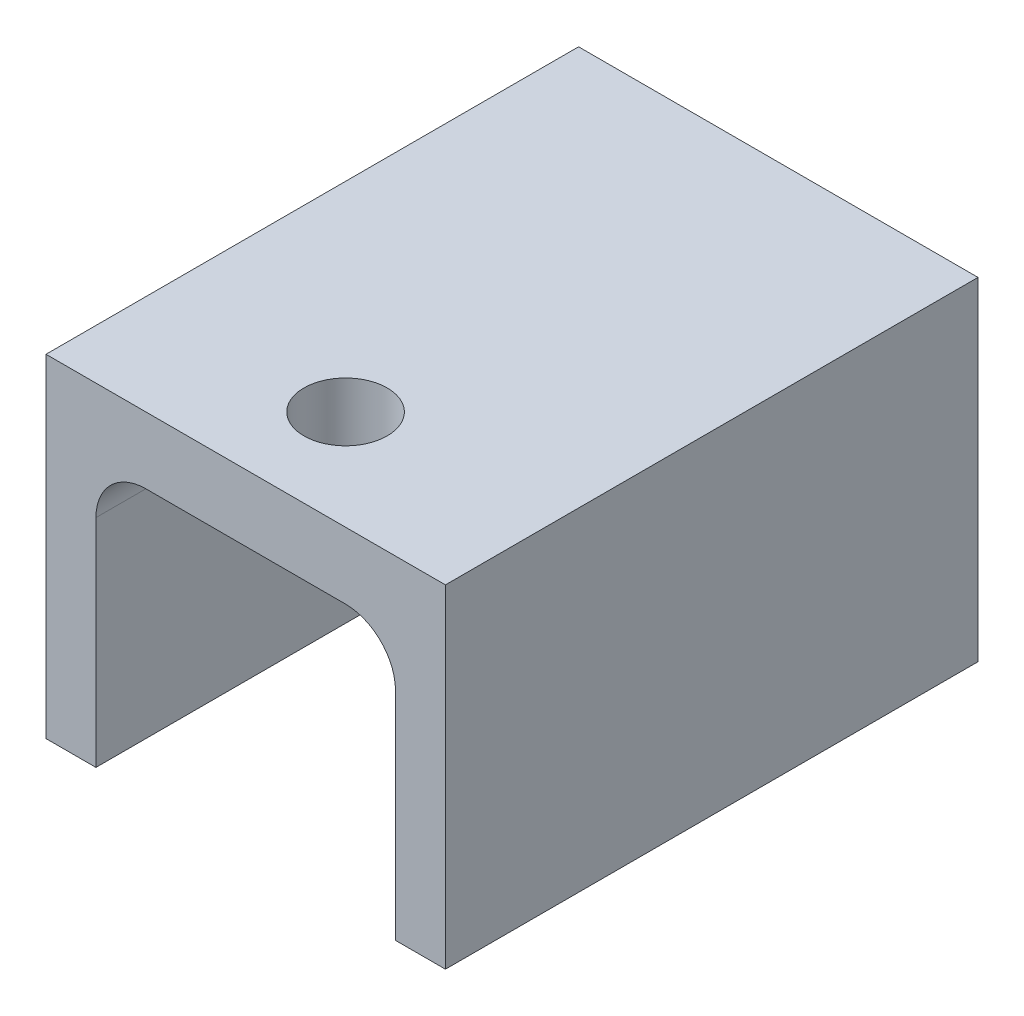
ISO-10303-21;
HEADER;
FILE_DESCRIPTION(('STEP AP214'),'2;1');
FILE_NAME('part.step','',(''),(''),'','','');
FILE_SCHEMA(('AUTOMOTIVE_DESIGN { 1 0 10303 214 1 1 1 1 }'));
ENDSEC;
DATA;
#1=APPLICATION_CONTEXT('core data for automotive mechanical design processes');
#2=APPLICATION_PROTOCOL_DEFINITION('international standard','automotive_design',2000,#1);
#3=PRODUCT_CONTEXT('',#1,'mechanical');
#4=PRODUCT('Part','Part','',(#3));
#5=PRODUCT_RELATED_PRODUCT_CATEGORY('part','',(#4));
#6=PRODUCT_DEFINITION_FORMATION('','',#4);
#7=PRODUCT_DEFINITION_CONTEXT('part definition',#1,'design');
#8=PRODUCT_DEFINITION('design','',#6,#7);
#9=PRODUCT_DEFINITION_SHAPE('','',#8);
#10=(LENGTH_UNIT() NAMED_UNIT(*) SI_UNIT(.MILLI.,.METRE.));
#11=(NAMED_UNIT(*) PLANE_ANGLE_UNIT() SI_UNIT($,.RADIAN.));
#12=(NAMED_UNIT(*) SI_UNIT($,.STERADIAN.) SOLID_ANGLE_UNIT());
#13=UNCERTAINTY_MEASURE_WITH_UNIT(LENGTH_MEASURE(1.E-05),#10,'distance_accuracy_value','');
#14=(GEOMETRIC_REPRESENTATION_CONTEXT(3) GLOBAL_UNCERTAINTY_ASSIGNED_CONTEXT((#13)) GLOBAL_UNIT_ASSIGNED_CONTEXT((#10,
#11,#12)) REPRESENTATION_CONTEXT('',''));
#15=CARTESIAN_POINT('',(0.,0.,0.));
#16=DIRECTION('',(0.,0.,1.));
#17=DIRECTION('',(1.,0.,0.));
#18=AXIS2_PLACEMENT_3D('',#15,#16,#17);
#19=CARTESIAN_POINT('',(-9.,10.,4.));
#20=DIRECTION('',(0.,-1.,0.));
#21=DIRECTION('',(0.,0.,-1.));
#22=AXIS2_PLACEMENT_3D('',#19,#20,#21);
#23=PLANE('',#22);
#24=CARTESIAN_POINT('',(0.,10.,26.));
#25=DIRECTION('',(0.,-1.,0.));
#26=DIRECTION('',(0.,0.,-1.));
#27=AXIS2_PLACEMENT_3D('',#24,#25,#26);
#28=CIRCLE('',#27,2.5);
#29=CARTESIAN_POINT('',(0.,10.,23.5));
#30=VERTEX_POINT('',#29);
#31=EDGE_CURVE('E178',#30,#30,#28,.T.);
#32=ORIENTED_EDGE('',*,*,#31,.T.);
#33=EDGE_LOOP('',(#32));
#34=FACE_BOUND('',#33,.T.);
#35=DIRECTION('',(-1.,0.,0.));
#36=VECTOR('',#35,1.);
#37=CARTESIAN_POINT('',(-9.,10.,0.));
#38=LINE('',#37,#36);
#39=CARTESIAN_POINT('',(12.,10.,0.));
#40=VERTEX_POINT('',#39);
#41=CARTESIAN_POINT('',(-12.,10.,0.));
#42=VERTEX_POINT('',#41);
#43=EDGE_CURVE('E190',#40,#42,#38,.T.);
#44=ORIENTED_EDGE('',*,*,#43,.T.);
#45=DIRECTION('',(0.,0.,-1.));
#46=VECTOR('',#45,1.);
#47=CARTESIAN_POINT('',(-12.,10.,0.));
#48=LINE('',#47,#46);
#49=CARTESIAN_POINT('',(-12.,10.,32.));
#50=VERTEX_POINT('',#49);
#51=EDGE_CURVE('E150',#50,#42,#48,.T.);
#52=ORIENTED_EDGE('',*,*,#51,.F.);
#53=DIRECTION('',(-1.,0.,0.));
#54=VECTOR('',#53,1.);
#55=CARTESIAN_POINT('',(-9.,10.,32.));
#56=LINE('',#55,#54);
#57=CARTESIAN_POINT('',(12.,10.,32.));
#58=VERTEX_POINT('',#57);
#59=EDGE_CURVE('E188',#58,#50,#56,.T.);
#60=ORIENTED_EDGE('',*,*,#59,.F.);
#61=DIRECTION('',(0.,0.,1.));
#62=VECTOR('',#61,1.);
#63=CARTESIAN_POINT('',(12.,10.,32.));
#64=LINE('',#63,#62);
#65=EDGE_CURVE('E162',#40,#58,#64,.T.);
#66=ORIENTED_EDGE('',*,*,#65,.F.);
#67=EDGE_LOOP('',(#44,#52,#60,#66));
#68=FACE_BOUND('',#67,.T.);
#69=ADVANCED_FACE('F36',(#34,#68),#23,.F.);
#70=CARTESIAN_POINT('',(-9.,-10.,4.));
#71=DIRECTION('',(0.,1.,0.));
#72=DIRECTION('',(0.,0.,1.));
#73=AXIS2_PLACEMENT_3D('',#70,#71,#72);
#74=PLANE('',#73);
#75=DIRECTION('',(1.,0.,0.));
#76=VECTOR('',#75,1.);
#77=CARTESIAN_POINT('',(-9.,-10.,0.));
#78=LINE('',#77,#76);
#79=CARTESIAN_POINT('',(-12.,-10.,0.));
#80=VERTEX_POINT('',#79);
#81=CARTESIAN_POINT('',(12.,-10.,0.));
#82=VERTEX_POINT('',#81);
#83=EDGE_CURVE('E195',#80,#82,#78,.T.);
#84=ORIENTED_EDGE('',*,*,#83,.T.);
#85=DIRECTION('',(0.,0.,-1.));
#86=VECTOR('',#85,1.);
#87=CARTESIAN_POINT('',(12.,-10.,0.));
#88=LINE('',#87,#86);
#89=CARTESIAN_POINT('',(12.,-10.,32.));
#90=VERTEX_POINT('',#89);
#91=EDGE_CURVE('E129',#90,#82,#88,.T.);
#92=ORIENTED_EDGE('',*,*,#91,.F.);
#93=DIRECTION('',(1.,0.,0.));
#94=VECTOR('',#93,1.);
#95=CARTESIAN_POINT('',(9.,-10.,32.));
#96=LINE('',#95,#94);
#97=CARTESIAN_POINT('',(9.,-10.,32.));
#98=VERTEX_POINT('',#97);
#99=EDGE_CURVE('E116',#98,#90,#96,.T.);
#100=ORIENTED_EDGE('',*,*,#99,.F.);
#101=DIRECTION('',(0.,0.,-1.));
#102=VECTOR('',#101,1.);
#103=CARTESIAN_POINT('',(9.,-10.,4.));
#104=LINE('',#103,#102);
#105=CARTESIAN_POINT('',(9.,-10.,4.));
#106=VERTEX_POINT('',#105);
#107=EDGE_CURVE('E121',#98,#106,#104,.T.);
#108=ORIENTED_EDGE('',*,*,#107,.T.);
#109=DIRECTION('',(1.,0.,0.));
#110=VECTOR('',#109,1.);
#111=CARTESIAN_POINT('',(-9.,-10.,4.));
#112=LINE('',#111,#110);
#113=CARTESIAN_POINT('',(-9.,-10.,4.));
#114=VERTEX_POINT('',#113);
#115=EDGE_CURVE('E197',#114,#106,#112,.T.);
#116=ORIENTED_EDGE('',*,*,#115,.F.);
#117=DIRECTION('',(0.,0.,1.));
#118=VECTOR('',#117,1.);
#119=CARTESIAN_POINT('',(-9.,-10.,4.));
#120=LINE('',#119,#118);
#121=CARTESIAN_POINT('',(-9.,-10.,32.));
#122=VERTEX_POINT('',#121);
#123=EDGE_CURVE('E139',#114,#122,#120,.T.);
#124=ORIENTED_EDGE('',*,*,#123,.T.);
#125=DIRECTION('',(-1.,0.,0.));
#126=VECTOR('',#125,1.);
#127=CARTESIAN_POINT('',(-9.,-10.,32.));
#128=LINE('',#127,#126);
#129=CARTESIAN_POINT('',(-12.,-10.,32.));
#130=VERTEX_POINT('',#129);
#131=EDGE_CURVE('E142',#122,#130,#128,.T.);
#132=ORIENTED_EDGE('',*,*,#131,.T.);
#133=DIRECTION('',(0.,0.,1.));
#134=VECTOR('',#133,1.);
#135=CARTESIAN_POINT('',(-12.,-10.,4.));
#136=LINE('',#135,#134);
#137=EDGE_CURVE('E145',#80,#130,#136,.T.);
#138=ORIENTED_EDGE('',*,*,#137,.F.);
#139=EDGE_LOOP('',(#84,#92,#100,#108,#116,#124,#132,#138));
#140=FACE_BOUND('',#139,.T.);
#141=ADVANCED_FACE('F126',(#140),#74,.F.);
#142=CARTESIAN_POINT('',(0.,0.,4.));
#143=DIRECTION('',(0.,0.,1.));
#144=DIRECTION('',(1.,0.,0.));
#145=AXIS2_PLACEMENT_3D('',#142,#143,#144);
#146=PLANE('',#145);
#147=CARTESIAN_POINT('',(-6.,-6.75,4.));
#148=DIRECTION('',(0.,0.,1.));
#149=DIRECTION('',(1.,0.,0.));
#150=AXIS2_PLACEMENT_3D('',#147,#148,#149);
#151=CIRCLE('',#150,1.5);
#152=CARTESIAN_POINT('',(-4.5,-6.75,4.));
#153=VERTEX_POINT('',#152);
#154=EDGE_CURVE('E169',#153,#153,#151,.T.);
#155=ORIENTED_EDGE('',*,*,#154,.F.);
#156=EDGE_LOOP('',(#155));
#157=FACE_BOUND('',#156,.T.);
#158=CARTESIAN_POINT('',(6.,-0.25,4.));
#159=DIRECTION('',(0.,0.,1.));
#160=DIRECTION('',(1.,0.,0.));
#161=AXIS2_PLACEMENT_3D('',#158,#159,#160);
#162=CIRCLE('',#161,1.5);
#163=CARTESIAN_POINT('',(7.5,-0.25,4.));
#164=VERTEX_POINT('',#163);
#165=EDGE_CURVE('E168',#164,#164,#162,.T.);
#166=ORIENTED_EDGE('',*,*,#165,.F.);
#167=EDGE_LOOP('',(#166));
#168=FACE_BOUND('',#167,.T.);
#169=CARTESIAN_POINT('',(6.,-6.75,4.));
#170=DIRECTION('',(0.,0.,1.));
#171=DIRECTION('',(1.,0.,0.));
#172=AXIS2_PLACEMENT_3D('',#169,#170,#171);
#173=CIRCLE('',#172,1.5);
#174=CARTESIAN_POINT('',(7.5,-6.75,4.));
#175=VERTEX_POINT('',#174);
#176=EDGE_CURVE('E165',#175,#175,#173,.T.);
#177=ORIENTED_EDGE('',*,*,#176,.F.);
#178=EDGE_LOOP('',(#177));
#179=FACE_BOUND('',#178,.T.);
#180=CARTESIAN_POINT('',(-6.,-0.25,4.));
#181=DIRECTION('',(0.,0.,1.));
#182=DIRECTION('',(1.,0.,0.));
#183=AXIS2_PLACEMENT_3D('',#180,#181,#182);
#184=CIRCLE('',#183,1.5);
#185=CARTESIAN_POINT('',(-4.5,-0.25,4.));
#186=VERTEX_POINT('',#185);
#187=EDGE_CURVE('E172',#186,#186,#184,.T.);
#188=ORIENTED_EDGE('',*,*,#187,.F.);
#189=EDGE_LOOP('',(#188));
#190=FACE_BOUND('',#189,.T.);
#191=DIRECTION('',(1.,0.,0.));
#192=VECTOR('',#191,1.);
#193=CARTESIAN_POINT('',(-9.,6.,4.));
#194=LINE('',#193,#192);
#195=CARTESIAN_POINT('',(-6.,6.,4.));
#196=VERTEX_POINT('',#195);
#197=CARTESIAN_POINT('',(6.,6.,4.));
#198=VERTEX_POINT('',#197);
#199=EDGE_CURVE('E181',#196,#198,#194,.T.);
#200=ORIENTED_EDGE('',*,*,#199,.F.);
#201=CARTESIAN_POINT('',(-6.,3.,4.));
#202=DIRECTION('',(0.,0.,1.));
#203=DIRECTION('',(1.,0.,0.));
#204=AXIS2_PLACEMENT_3D('',#201,#202,#203);
#205=CIRCLE('',#204,3.);
#206=CARTESIAN_POINT('',(-9.,3.,4.));
#207=VERTEX_POINT('',#206);
#208=EDGE_CURVE('E218',#196,#207,#205,.T.);
#209=ORIENTED_EDGE('',*,*,#208,.T.);
#210=DIRECTION('',(0.,-1.,0.));
#211=VECTOR('',#210,1.);
#212=CARTESIAN_POINT('',(-9.,10.,4.));
#213=LINE('',#212,#211);
#214=EDGE_CURVE('E194',#207,#114,#213,.T.);
#215=ORIENTED_EDGE('',*,*,#214,.T.);
#216=ORIENTED_EDGE('',*,*,#115,.T.);
#217=DIRECTION('',(0.,1.,0.));
#218=VECTOR('',#217,1.);
#219=CARTESIAN_POINT('',(9.,10.,4.));
#220=LINE('',#219,#218);
#221=CARTESIAN_POINT('',(9.,3.,4.));
#222=VERTEX_POINT('',#221);
#223=EDGE_CURVE('E135',#106,#222,#220,.T.);
#224=ORIENTED_EDGE('',*,*,#223,.T.);
#225=CARTESIAN_POINT('',(6.,3.,4.));
#226=DIRECTION('',(0.,0.,1.));
#227=DIRECTION('',(1.,0.,0.));
#228=AXIS2_PLACEMENT_3D('',#225,#226,#227);
#229=CIRCLE('',#228,3.);
#230=EDGE_CURVE('E216',#222,#198,#229,.T.);
#231=ORIENTED_EDGE('',*,*,#230,.T.);
#232=EDGE_LOOP('',(#200,#209,#215,#216,#224,#231));
#233=FACE_BOUND('',#232,.T.);
#234=ADVANCED_FACE('F232',(#157,#168,#179,#190,#233),#146,.T.);
#235=CARTESIAN_POINT('',(0.,0.,0.));
#236=DIRECTION('',(0.,0.,1.));
#237=DIRECTION('',(1.,0.,0.));
#238=AXIS2_PLACEMENT_3D('',#235,#236,#237);
#239=PLANE('',#238);
#240=CARTESIAN_POINT('',(-6.,-6.75,0.));
#241=DIRECTION('',(0.,0.,1.));
#242=DIRECTION('',(1.,0.,0.));
#243=AXIS2_PLACEMENT_3D('',#240,#241,#242);
#244=CIRCLE('',#243,1.5);
#245=CARTESIAN_POINT('',(-4.5,-6.75,0.));
#246=VERTEX_POINT('',#245);
#247=EDGE_CURVE('E185',#246,#246,#244,.T.);
#248=ORIENTED_EDGE('',*,*,#247,.T.);
#249=EDGE_LOOP('',(#248));
#250=FACE_BOUND('',#249,.T.);
#251=CARTESIAN_POINT('',(6.,-0.25,0.));
#252=DIRECTION('',(0.,0.,1.));
#253=DIRECTION('',(1.,0.,0.));
#254=AXIS2_PLACEMENT_3D('',#251,#252,#253);
#255=CIRCLE('',#254,1.5);
#256=CARTESIAN_POINT('',(7.5,-0.25,0.));
#257=VERTEX_POINT('',#256);
#258=EDGE_CURVE('E207',#257,#257,#255,.T.);
#259=ORIENTED_EDGE('',*,*,#258,.T.);
#260=EDGE_LOOP('',(#259));
#261=FACE_BOUND('',#260,.T.);
#262=CARTESIAN_POINT('',(6.,-6.75,0.));
#263=DIRECTION('',(0.,0.,1.));
#264=DIRECTION('',(1.,0.,0.));
#265=AXIS2_PLACEMENT_3D('',#262,#263,#264);
#266=CIRCLE('',#265,1.5);
#267=CARTESIAN_POINT('',(7.5,-6.75,0.));
#268=VERTEX_POINT('',#267);
#269=EDGE_CURVE('E204',#268,#268,#266,.T.);
#270=ORIENTED_EDGE('',*,*,#269,.T.);
#271=EDGE_LOOP('',(#270));
#272=FACE_BOUND('',#271,.T.);
#273=CARTESIAN_POINT('',(-6.,-0.25,0.));
#274=DIRECTION('',(0.,0.,1.));
#275=DIRECTION('',(1.,0.,0.));
#276=AXIS2_PLACEMENT_3D('',#273,#274,#275);
#277=CIRCLE('',#276,1.5);
#278=CARTESIAN_POINT('',(-4.5,-0.25,0.));
#279=VERTEX_POINT('',#278);
#280=EDGE_CURVE('E177',#279,#279,#277,.T.);
#281=ORIENTED_EDGE('',*,*,#280,.T.);
#282=EDGE_LOOP('',(#281));
#283=FACE_BOUND('',#282,.T.);
#284=ORIENTED_EDGE('',*,*,#43,.F.);
#285=DIRECTION('',(0.,1.,0.));
#286=VECTOR('',#285,1.);
#287=CARTESIAN_POINT('',(12.,10.,0.));
#288=LINE('',#287,#286);
#289=EDGE_CURVE('E159',#82,#40,#288,.T.);
#290=ORIENTED_EDGE('',*,*,#289,.F.);
#291=ORIENTED_EDGE('',*,*,#83,.F.);
#292=DIRECTION('',(0.,-1.,0.));
#293=VECTOR('',#292,1.);
#294=CARTESIAN_POINT('',(-12.,-10.,0.));
#295=LINE('',#294,#293);
#296=EDGE_CURVE('E153',#42,#80,#295,.T.);
#297=ORIENTED_EDGE('',*,*,#296,.F.);
#298=EDGE_LOOP('',(#284,#290,#291,#297));
#299=FACE_BOUND('',#298,.T.);
#300=ADVANCED_FACE('F250',(#250,#261,#272,#283,#299),#239,.F.);
#301=CARTESIAN_POINT('',(-9.,6.,32.));
#302=DIRECTION('',(0.,1.,0.));
#303=DIRECTION('',(0.,0.,1.));
#304=AXIS2_PLACEMENT_3D('',#301,#302,#303);
#305=PLANE('',#304);
#306=CARTESIAN_POINT('',(0.,6.,26.));
#307=DIRECTION('',(0.,-1.,0.));
#308=DIRECTION('',(0.,0.,-1.));
#309=AXIS2_PLACEMENT_3D('',#306,#307,#308);
#310=CIRCLE('',#309,2.5);
#311=CARTESIAN_POINT('',(0.,6.,23.5));
#312=VERTEX_POINT('',#311);
#313=EDGE_CURVE('E182',#312,#312,#310,.T.);
#314=ORIENTED_EDGE('',*,*,#313,.F.);
#315=EDGE_LOOP('',(#314));
#316=FACE_BOUND('',#315,.T.);
#317=DIRECTION('',(1.,0.,0.));
#318=VECTOR('',#317,1.);
#319=CARTESIAN_POINT('',(-9.,6.,32.));
#320=LINE('',#319,#318);
#321=CARTESIAN_POINT('',(-6.,6.,32.));
#322=VERTEX_POINT('',#321);
#323=CARTESIAN_POINT('',(6.,6.,32.));
#324=VERTEX_POINT('',#323);
#325=EDGE_CURVE('E186',#322,#324,#320,.T.);
#326=ORIENTED_EDGE('',*,*,#325,.F.);
#327=DIRECTION('',(0.,0.,-1.));
#328=VECTOR('',#327,1.);
#329=CARTESIAN_POINT('',(-6.,6.,32.));
#330=LINE('',#329,#328);
#331=EDGE_CURVE('E213',#322,#196,#330,.T.);
#332=ORIENTED_EDGE('',*,*,#331,.T.);
#333=ORIENTED_EDGE('',*,*,#199,.T.);
#334=DIRECTION('',(0.,0.,-1.));
#335=VECTOR('',#334,1.);
#336=CARTESIAN_POINT('',(6.,6.,32.));
#337=LINE('',#336,#335);
#338=EDGE_CURVE('E199',#198,#324,#337,.F.);
#339=ORIENTED_EDGE('',*,*,#338,.T.);
#340=EDGE_LOOP('',(#326,#332,#333,#339));
#341=FACE_BOUND('',#340,.T.);
#342=ADVANCED_FACE('F227',(#316,#341),#305,.F.);
#343=CARTESIAN_POINT('',(0.,0.,32.));
#344=DIRECTION('',(0.,0.,1.));
#345=DIRECTION('',(1.,0.,0.));
#346=AXIS2_PLACEMENT_3D('',#343,#344,#345);
#347=PLANE('',#346);
#348=ORIENTED_EDGE('',*,*,#59,.T.);
#349=DIRECTION('',(0.,1.,0.));
#350=VECTOR('',#349,1.);
#351=CARTESIAN_POINT('',(-12.,10.,32.));
#352=LINE('',#351,#350);
#353=EDGE_CURVE('E147',#130,#50,#352,.T.);
#354=ORIENTED_EDGE('',*,*,#353,.F.);
#355=ORIENTED_EDGE('',*,*,#131,.F.);
#356=DIRECTION('',(0.,1.,0.));
#357=VECTOR('',#356,1.);
#358=CARTESIAN_POINT('',(-9.,-10.,32.));
#359=LINE('',#358,#357);
#360=CARTESIAN_POINT('',(-9.,3.,32.));
#361=VERTEX_POINT('',#360);
#362=EDGE_CURVE('E130',#122,#361,#359,.T.);
#363=ORIENTED_EDGE('',*,*,#362,.T.);
#364=CARTESIAN_POINT('',(-6.,3.,32.));
#365=DIRECTION('',(0.,0.,1.));
#366=DIRECTION('',(1.,0.,0.));
#367=AXIS2_PLACEMENT_3D('',#364,#365,#366);
#368=CIRCLE('',#367,3.);
#369=EDGE_CURVE('E44',#361,#322,#368,.F.);
#370=ORIENTED_EDGE('',*,*,#369,.T.);
#371=ORIENTED_EDGE('',*,*,#325,.T.);
#372=CARTESIAN_POINT('',(6.,3.,32.));
#373=DIRECTION('',(0.,0.,1.));
#374=DIRECTION('',(1.,0.,0.));
#375=AXIS2_PLACEMENT_3D('',#372,#373,#374);
#376=CIRCLE('',#375,3.);
#377=CARTESIAN_POINT('',(9.,3.,32.));
#378=VERTEX_POINT('',#377);
#379=EDGE_CURVE('E11',#324,#378,#376,.F.);
#380=ORIENTED_EDGE('',*,*,#379,.T.);
#381=DIRECTION('',(0.,-1.,0.));
#382=VECTOR('',#381,1.);
#383=CARTESIAN_POINT('',(9.,-10.,32.));
#384=LINE('',#383,#382);
#385=EDGE_CURVE('E112',#378,#98,#384,.T.);
#386=ORIENTED_EDGE('',*,*,#385,.T.);
#387=ORIENTED_EDGE('',*,*,#99,.T.);
#388=DIRECTION('',(0.,-1.,0.));
#389=VECTOR('',#388,1.);
#390=CARTESIAN_POINT('',(12.,6.,32.));
#391=LINE('',#390,#389);
#392=EDGE_CURVE('E156',#58,#90,#391,.T.);
#393=ORIENTED_EDGE('',*,*,#392,.F.);
#394=EDGE_LOOP('',(#348,#354,#355,#363,#370,#371,#380,#386,#387,#393));
#395=FACE_BOUND('',#394,.T.);
#396=ADVANCED_FACE('F114',(#395),#347,.T.);
#397=CARTESIAN_POINT('',(0.,10.,26.));
#398=DIRECTION('',(0.,-1.,0.));
#399=DIRECTION('',(0.,0.,-1.));
#400=AXIS2_PLACEMENT_3D('',#397,#398,#399);
#401=CYLINDRICAL_SURFACE('',#400,2.5);
#402=ORIENTED_EDGE('',*,*,#31,.F.);
#403=EDGE_LOOP('',(#402));
#404=FACE_BOUND('',#403,.T.);
#405=ORIENTED_EDGE('',*,*,#313,.T.);
#406=EDGE_LOOP('',(#405));
#407=FACE_BOUND('',#406,.T.);
#408=ADVANCED_FACE('F262',(#404,#407),#401,.F.);
#409=CARTESIAN_POINT('',(-6.,-0.25,-28.));
#410=DIRECTION('',(0.,0.,1.));
#411=DIRECTION('',(1.,0.,0.));
#412=AXIS2_PLACEMENT_3D('',#409,#410,#411);
#413=CYLINDRICAL_SURFACE('',#412,1.5);
#414=ORIENTED_EDGE('',*,*,#187,.T.);
#415=EDGE_LOOP('',(#414));
#416=FACE_BOUND('',#415,.T.);
#417=ORIENTED_EDGE('',*,*,#280,.F.);
#418=EDGE_LOOP('',(#417));
#419=FACE_BOUND('',#418,.T.);
#420=ADVANCED_FACE('F265',(#416,#419),#413,.F.);
#421=CARTESIAN_POINT('',(6.,-6.75,-28.));
#422=DIRECTION('',(0.,0.,1.));
#423=DIRECTION('',(1.,0.,0.));
#424=AXIS2_PLACEMENT_3D('',#421,#422,#423);
#425=CYLINDRICAL_SURFACE('',#424,1.5);
#426=ORIENTED_EDGE('',*,*,#176,.T.);
#427=EDGE_LOOP('',(#426));
#428=FACE_BOUND('',#427,.T.);
#429=ORIENTED_EDGE('',*,*,#269,.F.);
#430=EDGE_LOOP('',(#429));
#431=FACE_BOUND('',#430,.T.);
#432=ADVANCED_FACE('F269',(#428,#431),#425,.F.);
#433=CARTESIAN_POINT('',(6.,-0.25,-28.));
#434=DIRECTION('',(0.,0.,1.));
#435=DIRECTION('',(1.,0.,0.));
#436=AXIS2_PLACEMENT_3D('',#433,#434,#435);
#437=CYLINDRICAL_SURFACE('',#436,1.5);
#438=ORIENTED_EDGE('',*,*,#165,.T.);
#439=EDGE_LOOP('',(#438));
#440=FACE_BOUND('',#439,.T.);
#441=ORIENTED_EDGE('',*,*,#258,.F.);
#442=EDGE_LOOP('',(#441));
#443=FACE_BOUND('',#442,.T.);
#444=ADVANCED_FACE('F271',(#440,#443),#437,.F.);
#445=CARTESIAN_POINT('',(-6.,-6.75,-28.));
#446=DIRECTION('',(0.,0.,1.));
#447=DIRECTION('',(1.,0.,0.));
#448=AXIS2_PLACEMENT_3D('',#445,#446,#447);
#449=CYLINDRICAL_SURFACE('',#448,1.5);
#450=ORIENTED_EDGE('',*,*,#154,.T.);
#451=EDGE_LOOP('',(#450));
#452=FACE_BOUND('',#451,.T.);
#453=ORIENTED_EDGE('',*,*,#247,.F.);
#454=EDGE_LOOP('',(#453));
#455=FACE_BOUND('',#454,.T.);
#456=ADVANCED_FACE('F274',(#452,#455),#449,.F.);
#457=CARTESIAN_POINT('',(12.,0.,0.));
#458=DIRECTION('',(-1.,0.,0.));
#459=DIRECTION('',(0.,0.,1.));
#460=AXIS2_PLACEMENT_3D('',#457,#458,#459);
#461=PLANE('',#460);
#462=ORIENTED_EDGE('',*,*,#392,.T.);
#463=ORIENTED_EDGE('',*,*,#91,.T.);
#464=ORIENTED_EDGE('',*,*,#289,.T.);
#465=ORIENTED_EDGE('',*,*,#65,.T.);
#466=EDGE_LOOP('',(#462,#463,#464,#465));
#467=FACE_BOUND('',#466,.T.);
#468=ADVANCED_FACE('F278',(#467),#461,.F.);
#469=CARTESIAN_POINT('',(9.,0.,0.));
#470=DIRECTION('',(-1.,0.,0.));
#471=DIRECTION('',(0.,0.,1.));
#472=AXIS2_PLACEMENT_3D('',#469,#470,#471);
#473=PLANE('',#472);
#474=ORIENTED_EDGE('',*,*,#385,.F.);
#475=DIRECTION('',(0.,0.,-1.));
#476=VECTOR('',#475,1.);
#477=CARTESIAN_POINT('',(9.,3.,0.));
#478=LINE('',#477,#476);
#479=EDGE_CURVE('E221',#378,#222,#478,.T.);
#480=ORIENTED_EDGE('',*,*,#479,.T.);
#481=ORIENTED_EDGE('',*,*,#223,.F.);
#482=ORIENTED_EDGE('',*,*,#107,.F.);
#483=EDGE_LOOP('',(#474,#480,#481,#482));
#484=FACE_BOUND('',#483,.T.);
#485=ADVANCED_FACE('F133',(#484),#473,.T.);
#486=CARTESIAN_POINT('',(-9.,0.,0.));
#487=DIRECTION('',(1.,0.,0.));
#488=DIRECTION('',(0.,0.,-1.));
#489=AXIS2_PLACEMENT_3D('',#486,#487,#488);
#490=PLANE('',#489);
#491=ORIENTED_EDGE('',*,*,#214,.F.);
#492=DIRECTION('',(0.,0.,-1.));
#493=VECTOR('',#492,1.);
#494=CARTESIAN_POINT('',(-9.,3.,0.));
#495=LINE('',#494,#493);
#496=EDGE_CURVE('E57',#207,#361,#495,.F.);
#497=ORIENTED_EDGE('',*,*,#496,.T.);
#498=ORIENTED_EDGE('',*,*,#362,.F.);
#499=ORIENTED_EDGE('',*,*,#123,.F.);
#500=EDGE_LOOP('',(#491,#497,#498,#499));
#501=FACE_BOUND('',#500,.T.);
#502=ADVANCED_FACE('F234',(#501),#490,.T.);
#503=CARTESIAN_POINT('',(-12.,0.,0.));
#504=DIRECTION('',(1.,0.,0.));
#505=DIRECTION('',(0.,0.,-1.));
#506=AXIS2_PLACEMENT_3D('',#503,#504,#505);
#507=PLANE('',#506);
#508=ORIENTED_EDGE('',*,*,#137,.T.);
#509=ORIENTED_EDGE('',*,*,#353,.T.);
#510=ORIENTED_EDGE('',*,*,#51,.T.);
#511=ORIENTED_EDGE('',*,*,#296,.T.);
#512=EDGE_LOOP('',(#508,#509,#510,#511));
#513=FACE_BOUND('',#512,.T.);
#514=ADVANCED_FACE('F240',(#513),#507,.F.);
#515=CARTESIAN_POINT('',(-6.,3.,32.));
#516=DIRECTION('',(0.,0.,-1.));
#517=DIRECTION('',(-1.,0.,0.));
#518=AXIS2_PLACEMENT_3D('',#515,#516,#517);
#519=CYLINDRICAL_SURFACE('',#518,3.);
#520=ORIENTED_EDGE('',*,*,#369,.F.);
#521=ORIENTED_EDGE('',*,*,#496,.F.);
#522=ORIENTED_EDGE('',*,*,#208,.F.);
#523=ORIENTED_EDGE('',*,*,#331,.F.);
#524=EDGE_LOOP('',(#520,#521,#522,#523));
#525=FACE_BOUND('',#524,.T.);
#526=ADVANCED_FACE('F230',(#525),#519,.F.);
#527=CARTESIAN_POINT('',(6.,3.,0.));
#528=DIRECTION('',(0.,0.,-1.));
#529=DIRECTION('',(-1.,0.,0.));
#530=AXIS2_PLACEMENT_3D('',#527,#528,#529);
#531=CYLINDRICAL_SURFACE('',#530,3.);
#532=ORIENTED_EDGE('',*,*,#379,.F.);
#533=ORIENTED_EDGE('',*,*,#338,.F.);
#534=ORIENTED_EDGE('',*,*,#230,.F.);
#535=ORIENTED_EDGE('',*,*,#479,.F.);
#536=EDGE_LOOP('',(#532,#533,#534,#535));
#537=FACE_BOUND('',#536,.T.);
#538=ADVANCED_FACE('F38',(#537),#531,.F.);
#539=CLOSED_SHELL('',(#69,#141,#234,#300,#342,#396,#408,#420,#432,#444,#456,#468,#485,#502,#514,
#526,#538));
#540=MANIFOLD_SOLID_BREP('B2',#539);
#541=ADVANCED_BREP_SHAPE_REPRESENTATION('',(#18,#540),#14);
#542=SHAPE_DEFINITION_REPRESENTATION(#9,#541);
ENDSEC;
END-ISO-10303-21;
